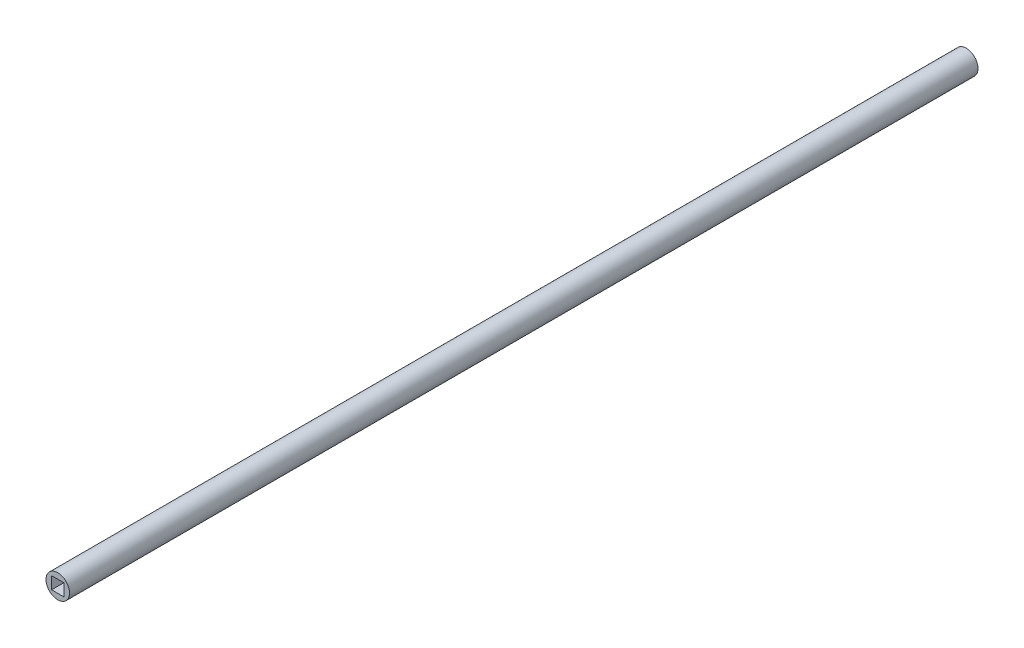
ISO-10303-21;
HEADER;
FILE_DESCRIPTION(('STEP AP214'),'2;1');
FILE_NAME('part.step','',(''),(''),'','','');
FILE_SCHEMA(('AUTOMOTIVE_DESIGN { 1 0 10303 214 1 1 1 1 }'));
ENDSEC;
DATA;
#1=APPLICATION_CONTEXT('core data for automotive mechanical design processes');
#2=APPLICATION_PROTOCOL_DEFINITION('international standard','automotive_design',2000,#1);
#3=PRODUCT_CONTEXT('',#1,'mechanical');
#4=PRODUCT('Part','Part','',(#3));
#5=PRODUCT_RELATED_PRODUCT_CATEGORY('part','',(#4));
#6=PRODUCT_DEFINITION_FORMATION('','',#4);
#7=PRODUCT_DEFINITION_CONTEXT('part definition',#1,'design');
#8=PRODUCT_DEFINITION('design','',#6,#7);
#9=PRODUCT_DEFINITION_SHAPE('','',#8);
#10=(LENGTH_UNIT() NAMED_UNIT(*) SI_UNIT(.MILLI.,.METRE.));
#11=(NAMED_UNIT(*) PLANE_ANGLE_UNIT() SI_UNIT($,.RADIAN.));
#12=(NAMED_UNIT(*) SI_UNIT($,.STERADIAN.) SOLID_ANGLE_UNIT());
#13=UNCERTAINTY_MEASURE_WITH_UNIT(LENGTH_MEASURE(1.E-05),#10,'distance_accuracy_value','');
#14=(GEOMETRIC_REPRESENTATION_CONTEXT(3) GLOBAL_UNCERTAINTY_ASSIGNED_CONTEXT((#13)) GLOBAL_UNIT_ASSIGNED_CONTEXT((#10,
#11,#12)) REPRESENTATION_CONTEXT('',''));
#15=CARTESIAN_POINT('',(0.,0.,0.));
#16=DIRECTION('',(0.,0.,1.));
#17=DIRECTION('',(1.,0.,0.));
#18=AXIS2_PLACEMENT_3D('',#15,#16,#17);
#19=CARTESIAN_POINT('',(0.,0.,245.360000008));
#20=DIRECTION('',(0.,0.,1.));
#21=DIRECTION('',(1.,0.,0.));
#22=AXIS2_PLACEMENT_3D('',#19,#20,#21);
#23=PLANE('',#22);
#24=CARTESIAN_POINT('',(0.,0.,245.360000008));
#25=DIRECTION('',(0.,0.,1.));
#26=DIRECTION('',(1.,0.,0.));
#27=AXIS2_PLACEMENT_3D('',#24,#25,#26);
#28=CIRCLE('',#27,3.175);
#29=CARTESIAN_POINT('',(-3.175,0.,245.360000008));
#30=VERTEX_POINT('',#29);
#31=EDGE_CURVE('E11',#30,#30,#28,.T.);
#32=ORIENTED_EDGE('',*,*,#31,.T.);
#33=EDGE_LOOP('',(#32));
#34=FACE_BOUND('',#33,.T.);
#35=DIRECTION('',(-1.,0.,0.));
#36=VECTOR('',#35,1.);
#37=CARTESIAN_POINT('',(-1.65102008785856,1.65102008785856,245.360000008));
#38=LINE('',#37,#36);
#39=CARTESIAN_POINT('',(1.65102008785856,1.65102008785856,245.360000008));
#40=VERTEX_POINT('',#39);
#41=CARTESIAN_POINT('',(-1.65102008785856,1.65102008785856,245.360000008));
#42=VERTEX_POINT('',#41);
#43=EDGE_CURVE('E96',#40,#42,#38,.T.);
#44=ORIENTED_EDGE('',*,*,#43,.F.);
#45=DIRECTION('',(0.,1.,0.));
#46=VECTOR('',#45,1.);
#47=CARTESIAN_POINT('',(1.65102008785856,1.65102008785856,245.360000008));
#48=LINE('',#47,#46);
#49=CARTESIAN_POINT('',(1.65102008785856,-1.65102008785856,245.360000008));
#50=VERTEX_POINT('',#49);
#51=EDGE_CURVE('E87',#50,#40,#48,.T.);
#52=ORIENTED_EDGE('',*,*,#51,.F.);
#53=DIRECTION('',(1.,0.,0.));
#54=VECTOR('',#53,1.);
#55=CARTESIAN_POINT('',(-1.65102008785856,-1.65102008785856,245.360000008));
#56=LINE('',#55,#54);
#57=CARTESIAN_POINT('',(-1.65102008785856,-1.65102008785856,245.360000008));
#58=VERTEX_POINT('',#57);
#59=EDGE_CURVE('E112',#58,#50,#56,.T.);
#60=ORIENTED_EDGE('',*,*,#59,.F.);
#61=DIRECTION('',(0.,-1.,0.));
#62=VECTOR('',#61,1.);
#63=CARTESIAN_POINT('',(-1.65102008785856,1.65102008785856,245.360000008));
#64=LINE('',#63,#62);
#65=EDGE_CURVE('E108',#42,#58,#64,.T.);
#66=ORIENTED_EDGE('',*,*,#65,.F.);
#67=EDGE_LOOP('',(#44,#52,#60,#66));
#68=FACE_BOUND('',#67,.T.);
#69=ADVANCED_FACE('F45',(#34,#68),#23,.T.);
#70=CARTESIAN_POINT('',(0.,0.,0.));
#71=DIRECTION('',(0.,0.,1.));
#72=DIRECTION('',(1.,0.,0.));
#73=AXIS2_PLACEMENT_3D('',#70,#71,#72);
#74=PLANE('',#73);
#75=CARTESIAN_POINT('',(0.,0.,0.));
#76=DIRECTION('',(0.,0.,1.));
#77=DIRECTION('',(1.,0.,0.));
#78=AXIS2_PLACEMENT_3D('',#75,#76,#77);
#79=CIRCLE('',#78,3.175);
#80=CARTESIAN_POINT('',(-3.175,0.,0.));
#81=VERTEX_POINT('',#80);
#82=EDGE_CURVE('E49',#81,#81,#79,.T.);
#83=ORIENTED_EDGE('',*,*,#82,.F.);
#84=EDGE_LOOP('',(#83));
#85=FACE_BOUND('',#84,.T.);
#86=DIRECTION('',(0.,1.,0.));
#87=VECTOR('',#86,1.);
#88=CARTESIAN_POINT('',(1.65102008785856,1.65102008785856,0.));
#89=LINE('',#88,#87);
#90=CARTESIAN_POINT('',(1.65102008785856,-1.65102008785856,0.));
#91=VERTEX_POINT('',#90);
#92=CARTESIAN_POINT('',(1.65102008785856,1.65102008785856,0.));
#93=VERTEX_POINT('',#92);
#94=EDGE_CURVE('E69',#91,#93,#89,.T.);
#95=ORIENTED_EDGE('',*,*,#94,.T.);
#96=DIRECTION('',(-1.,0.,0.));
#97=VECTOR('',#96,1.);
#98=CARTESIAN_POINT('',(-1.65102008785856,1.65102008785856,0.));
#99=LINE('',#98,#97);
#100=CARTESIAN_POINT('',(-1.65102008785856,1.65102008785856,0.));
#101=VERTEX_POINT('',#100);
#102=EDGE_CURVE('E103',#93,#101,#99,.T.);
#103=ORIENTED_EDGE('',*,*,#102,.T.);
#104=DIRECTION('',(0.,-1.,0.));
#105=VECTOR('',#104,1.);
#106=CARTESIAN_POINT('',(-1.65102008785856,1.65102008785856,0.));
#107=LINE('',#106,#105);
#108=CARTESIAN_POINT('',(-1.65102008785856,-1.65102008785856,0.));
#109=VERTEX_POINT('',#108);
#110=EDGE_CURVE('E121',#101,#109,#107,.T.);
#111=ORIENTED_EDGE('',*,*,#110,.T.);
#112=DIRECTION('',(1.,0.,0.));
#113=VECTOR('',#112,1.);
#114=CARTESIAN_POINT('',(-1.65102008785856,-1.65102008785856,0.));
#115=LINE('',#114,#113);
#116=EDGE_CURVE('E97',#109,#91,#115,.T.);
#117=ORIENTED_EDGE('',*,*,#116,.T.);
#118=EDGE_LOOP('',(#95,#103,#111,#117));
#119=FACE_BOUND('',#118,.T.);
#120=ADVANCED_FACE('F137',(#85,#119),#74,.F.);
#121=CARTESIAN_POINT('',(0.,0.,245.360000008));
#122=DIRECTION('',(0.,0.,-1.));
#123=DIRECTION('',(-1.,0.,0.));
#124=AXIS2_PLACEMENT_3D('',#121,#122,#123);
#125=CYLINDRICAL_SURFACE('',#124,3.175);
#126=CARTESIAN_POINT('',(-3.175,0.,245.360000008));
#127=CARTESIAN_POINT('',(-3.175,0.,242.804166674583));
#128=CARTESIAN_POINT('',(-3.175,0.,240.248333341167));
#129=CARTESIAN_POINT('',(-3.175,0.,235.136666674333));
#130=CARTESIAN_POINT('',(-3.175,0.,232.580833340917));
#131=CARTESIAN_POINT('',(-3.175,0.,227.469166674083));
#132=CARTESIAN_POINT('',(-3.175,0.,224.913333340667));
#133=CARTESIAN_POINT('',(-3.175,0.,219.801666673833));
#134=CARTESIAN_POINT('',(-3.175,0.,217.245833340417));
#135=CARTESIAN_POINT('',(-3.175,0.,212.134166673583));
#136=CARTESIAN_POINT('',(-3.175,0.,209.578333340167));
#137=CARTESIAN_POINT('',(-3.175,0.,204.466666673333));
#138=CARTESIAN_POINT('',(-3.175,0.,201.910833339917));
#139=CARTESIAN_POINT('',(-3.175,0.,196.799166673083));
#140=CARTESIAN_POINT('',(-3.175,0.,194.243333339667));
#141=CARTESIAN_POINT('',(-3.175,0.,189.131666672833));
#142=CARTESIAN_POINT('',(-3.175,0.,186.575833339417));
#143=CARTESIAN_POINT('',(-3.175,0.,181.464166672583));
#144=CARTESIAN_POINT('',(-3.175,0.,178.908333339167));
#145=CARTESIAN_POINT('',(-3.175,0.,173.796666672333));
#146=CARTESIAN_POINT('',(-3.175,0.,171.240833338917));
#147=CARTESIAN_POINT('',(-3.175,0.,166.129166672083));
#148=CARTESIAN_POINT('',(-3.175,0.,163.573333338667));
#149=CARTESIAN_POINT('',(-3.175,0.,158.461666671833));
#150=CARTESIAN_POINT('',(-3.175,0.,155.905833338417));
#151=CARTESIAN_POINT('',(-3.175,0.,150.794166671583));
#152=CARTESIAN_POINT('',(-3.175,0.,148.238333338167));
#153=CARTESIAN_POINT('',(-3.175,0.,143.126666671333));
#154=CARTESIAN_POINT('',(-3.175,0.,140.570833337917));
#155=CARTESIAN_POINT('',(-3.175,0.,135.459166671083));
#156=CARTESIAN_POINT('',(-3.175,0.,132.903333337667));
#157=CARTESIAN_POINT('',(-3.175,0.,127.791666670833));
#158=CARTESIAN_POINT('',(-3.175,0.,125.235833337417));
#159=CARTESIAN_POINT('',(-3.175,0.,120.124166670583));
#160=CARTESIAN_POINT('',(-3.175,0.,117.568333337167));
#161=CARTESIAN_POINT('',(-3.175,0.,112.456666670333));
#162=CARTESIAN_POINT('',(-3.175,0.,109.900833336917));
#163=CARTESIAN_POINT('',(-3.175,0.,104.789166670083));
#164=CARTESIAN_POINT('',(-3.175,0.,102.233333336667));
#165=CARTESIAN_POINT('',(-3.175,0.,97.1216666698333));
#166=CARTESIAN_POINT('',(-3.175,0.,94.5658333364167));
#167=CARTESIAN_POINT('',(-3.175,0.,89.4541666695833));
#168=CARTESIAN_POINT('',(-3.175,0.,86.8983333361667));
#169=CARTESIAN_POINT('',(-3.175,0.,81.7866666693333));
#170=CARTESIAN_POINT('',(-3.175,0.,79.2308333359167));
#171=CARTESIAN_POINT('',(-3.175,0.,74.1191666690833));
#172=CARTESIAN_POINT('',(-3.175,0.,71.5633333356667));
#173=CARTESIAN_POINT('',(-3.175,0.,66.4516666688333));
#174=CARTESIAN_POINT('',(-3.175,0.,63.8958333354167));
#175=CARTESIAN_POINT('',(-3.175,0.,58.7841666685833));
#176=CARTESIAN_POINT('',(-3.175,0.,56.2283333351667));
#177=CARTESIAN_POINT('',(-3.175,0.,51.1166666683333));
#178=CARTESIAN_POINT('',(-3.175,0.,48.5608333349167));
#179=CARTESIAN_POINT('',(-3.175,0.,43.4491666680833));
#180=CARTESIAN_POINT('',(-3.175,0.,40.8933333346667));
#181=CARTESIAN_POINT('',(-3.175,0.,35.7816666678333));
#182=CARTESIAN_POINT('',(-3.175,0.,33.2258333344167));
#183=CARTESIAN_POINT('',(-3.175,0.,28.1141666675833));
#184=CARTESIAN_POINT('',(-3.175,0.,25.5583333341667));
#185=CARTESIAN_POINT('',(-3.175,0.,20.4466666673333));
#186=CARTESIAN_POINT('',(-3.175,0.,17.8908333339167));
#187=CARTESIAN_POINT('',(-3.175,0.,12.7791666670833));
#188=CARTESIAN_POINT('',(-3.175,0.,10.2233333336667));
#189=CARTESIAN_POINT('',(-3.175,0.,5.11166666683332));
#190=CARTESIAN_POINT('',(-3.175,0.,2.55583333341666));
#191=CARTESIAN_POINT('',(-3.175,0.,0.));
#192=B_SPLINE_CURVE_WITH_KNOTS('',3,(#126,#127,#128,#129,#130,#131,#132,#133,#134,#135,#136,
#137,#138,#139,#140,#141,#142,#143,#144,#145,#146,#147,#148,#149,#150,#151,#152,#153,#154,#155,
#156,#157,#158,#159,#160,#161,#162,#163,#164,#165,#166,#167,#168,#169,#170,#171,#172,#173,#174,
#175,#176,#177,#178,#179,#180,#181,#182,#183,#184,#185,#186,#187,#188,#189,#190,#191),
.UNSPECIFIED.,.F.,.F.,(4,2,2,2,2,2,2,2,2,2,2,2,2,2,2,2,2,2,2,2,2,2,2,2,2,2,2,2,2,2,2,2,4),(0.,
7.66750000025002,15.3350000005,23.00250000075,30.670000001,38.33750000125,46.0050000015,
53.67250000175,61.340000002,69.00750000225,76.6750000025,84.34250000275,92.010000003,
99.67750000325,107.3450000035,115.01250000375,122.680000004,130.34750000425,138.0150000045,
145.68250000475,153.350000005,161.01750000525,168.6850000055,176.35250000575,184.020000006,
191.68750000625,199.3550000065,207.02250000675,214.690000007,222.35750000725,230.0250000075,
237.69250000775,245.360000008),.UNSPECIFIED.);
#193=EDGE_CURVE('BSEAM47',#30,#81,#192,.T.);
#194=ORIENTED_EDGE('',*,*,#31,.F.);
#195=ORIENTED_EDGE('',*,*,#82,.T.);
#196=ORIENTED_EDGE('',*,*,#193,.T.);
#197=ORIENTED_EDGE('',*,*,#193,.F.);
#198=EDGE_LOOP('',(#194,#196,#195,#197));
#199=FACE_BOUND('',#198,.T.);
#200=ADVANCED_FACE('F47',(#199),#125,.T.);
#201=CARTESIAN_POINT('',(1.65102008785856,1.65102008785856,245.360000008));
#202=DIRECTION('',(-1.,0.,0.));
#203=DIRECTION('',(0.,-1.,0.));
#204=AXIS2_PLACEMENT_3D('',#201,#202,#203);
#205=PLANE('',#204);
#206=ORIENTED_EDGE('',*,*,#94,.F.);
#207=DIRECTION('',(0.,0.,-1.));
#208=VECTOR('',#207,1.);
#209=CARTESIAN_POINT('',(1.65102008785856,-1.65102008785856,245.360000008));
#210=LINE('',#209,#208);
#211=EDGE_CURVE('E91',#50,#91,#210,.T.);
#212=ORIENTED_EDGE('',*,*,#211,.F.);
#213=ORIENTED_EDGE('',*,*,#51,.T.);
#214=DIRECTION('',(0.,0.,-1.));
#215=VECTOR('',#214,1.);
#216=CARTESIAN_POINT('',(1.65102008785856,1.65102008785856,245.360000008));
#217=LINE('',#216,#215);
#218=EDGE_CURVE('E90',#40,#93,#217,.T.);
#219=ORIENTED_EDGE('',*,*,#218,.T.);
#220=EDGE_LOOP('',(#206,#212,#213,#219));
#221=FACE_BOUND('',#220,.T.);
#222=ADVANCED_FACE('F89',(#221),#205,.T.);
#223=CARTESIAN_POINT('',(-1.65102008785856,1.65102008785856,245.360000008));
#224=DIRECTION('',(0.,-1.,0.));
#225=DIRECTION('',(0.,0.,-1.));
#226=AXIS2_PLACEMENT_3D('',#223,#224,#225);
#227=PLANE('',#226);
#228=ORIENTED_EDGE('',*,*,#102,.F.);
#229=ORIENTED_EDGE('',*,*,#218,.F.);
#230=ORIENTED_EDGE('',*,*,#43,.T.);
#231=DIRECTION('',(0.,0.,-1.));
#232=VECTOR('',#231,1.);
#233=CARTESIAN_POINT('',(-1.65102008785856,1.65102008785856,245.360000008));
#234=LINE('',#233,#232);
#235=EDGE_CURVE('E105',#42,#101,#234,.T.);
#236=ORIENTED_EDGE('',*,*,#235,.T.);
#237=EDGE_LOOP('',(#228,#229,#230,#236));
#238=FACE_BOUND('',#237,.T.);
#239=ADVANCED_FACE('F100',(#238),#227,.T.);
#240=CARTESIAN_POINT('',(-1.65102008785856,1.65102008785856,245.360000008));
#241=DIRECTION('',(1.,0.,0.));
#242=DIRECTION('',(0.,1.,0.));
#243=AXIS2_PLACEMENT_3D('',#240,#241,#242);
#244=PLANE('',#243);
#245=ORIENTED_EDGE('',*,*,#110,.F.);
#246=ORIENTED_EDGE('',*,*,#235,.F.);
#247=ORIENTED_EDGE('',*,*,#65,.T.);
#248=DIRECTION('',(0.,0.,-1.));
#249=VECTOR('',#248,1.);
#250=CARTESIAN_POINT('',(-1.65102008785856,-1.65102008785856,245.360000008));
#251=LINE('',#250,#249);
#252=EDGE_CURVE('E61',#58,#109,#251,.T.);
#253=ORIENTED_EDGE('',*,*,#252,.T.);
#254=EDGE_LOOP('',(#245,#246,#247,#253));
#255=FACE_BOUND('',#254,.T.);
#256=ADVANCED_FACE('F135',(#255),#244,.T.);
#257=CARTESIAN_POINT('',(-1.65102008785856,-1.65102008785856,245.360000008));
#258=DIRECTION('',(0.,1.,0.));
#259=DIRECTION('',(0.,0.,1.));
#260=AXIS2_PLACEMENT_3D('',#257,#258,#259);
#261=PLANE('',#260);
#262=ORIENTED_EDGE('',*,*,#116,.F.);
#263=ORIENTED_EDGE('',*,*,#252,.F.);
#264=ORIENTED_EDGE('',*,*,#59,.T.);
#265=ORIENTED_EDGE('',*,*,#211,.T.);
#266=EDGE_LOOP('',(#262,#263,#264,#265));
#267=FACE_BOUND('',#266,.T.);
#268=ADVANCED_FACE('F138',(#267),#261,.T.);
#269=CLOSED_SHELL('',(#69,#120,#200,#222,#239,#256,#268));
#270=MANIFOLD_SOLID_BREP('B2',#269);
#271=ADVANCED_BREP_SHAPE_REPRESENTATION('',(#18,#270),#14);
#272=SHAPE_DEFINITION_REPRESENTATION(#9,#271);
ENDSEC;
END-ISO-10303-21;
